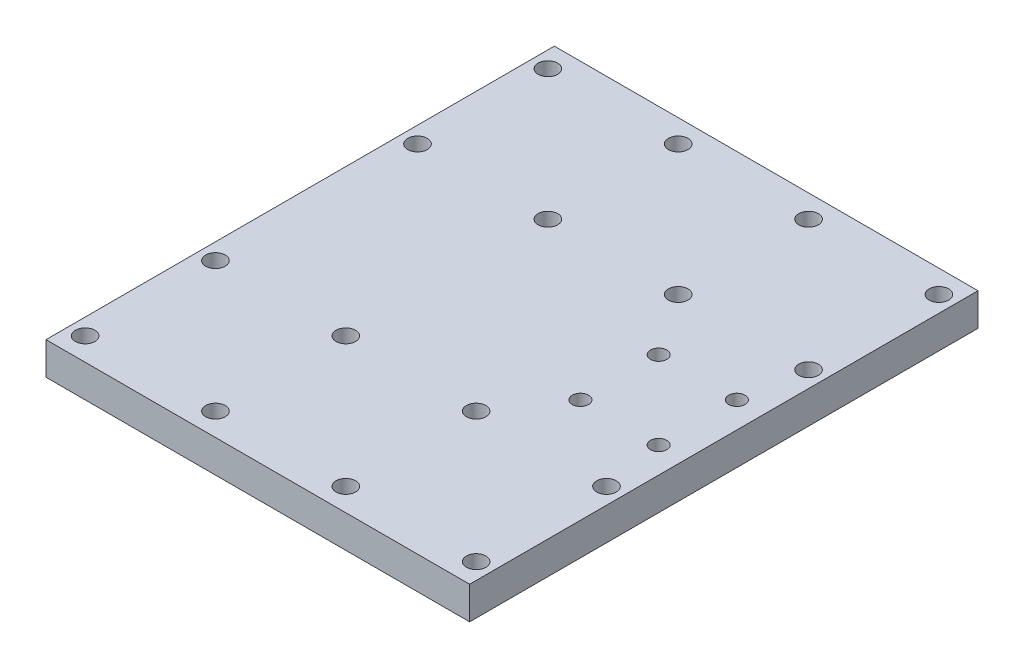
ISO-10303-21;
HEADER;
FILE_DESCRIPTION(('STEP AP214'),'2;1');
FILE_NAME('part.step','',(''),(''),'','','');
FILE_SCHEMA(('AUTOMOTIVE_DESIGN { 1 0 10303 214 1 1 1 1 }'));
ENDSEC;
DATA;
#1=APPLICATION_CONTEXT('core data for automotive mechanical design processes');
#2=APPLICATION_PROTOCOL_DEFINITION('international standard','automotive_design',2000,#1);
#3=PRODUCT_CONTEXT('',#1,'mechanical');
#4=PRODUCT('Part','Part','',(#3));
#5=PRODUCT_RELATED_PRODUCT_CATEGORY('part','',(#4));
#6=PRODUCT_DEFINITION_FORMATION('','',#4);
#7=PRODUCT_DEFINITION_CONTEXT('part definition',#1,'design');
#8=PRODUCT_DEFINITION('design','',#6,#7);
#9=PRODUCT_DEFINITION_SHAPE('','',#8);
#10=(LENGTH_UNIT() NAMED_UNIT(*) SI_UNIT(.MILLI.,.METRE.));
#11=(NAMED_UNIT(*) PLANE_ANGLE_UNIT() SI_UNIT($,.RADIAN.));
#12=(NAMED_UNIT(*) SI_UNIT($,.STERADIAN.) SOLID_ANGLE_UNIT());
#13=UNCERTAINTY_MEASURE_WITH_UNIT(LENGTH_MEASURE(1.E-05),#10,'distance_accuracy_value','');
#14=(GEOMETRIC_REPRESENTATION_CONTEXT(3) GLOBAL_UNCERTAINTY_ASSIGNED_CONTEXT((#13)) GLOBAL_UNIT_ASSIGNED_CONTEXT((#10,
#11,#12)) REPRESENTATION_CONTEXT('',''));
#15=CARTESIAN_POINT('',(0.,0.,0.));
#16=DIRECTION('',(0.,0.,1.));
#17=DIRECTION('',(1.,0.,0.));
#18=AXIS2_PLACEMENT_3D('',#15,#16,#17);
#19=CARTESIAN_POINT('',(130.,10.,0.));
#20=DIRECTION('',(-1.,0.,0.));
#21=DIRECTION('',(0.,0.,1.));
#22=AXIS2_PLACEMENT_3D('',#19,#20,#21);
#23=PLANE('',#22);
#24=DIRECTION('',(0.,0.,-1.));
#25=VECTOR('',#24,1.);
#26=CARTESIAN_POINT('',(130.,10.,0.));
#27=LINE('',#26,#25);
#28=CARTESIAN_POINT('',(130.,10.,121.506875339482));
#29=VERTEX_POINT('',#28);
#30=CARTESIAN_POINT('',(130.,10.,-34.4931246605184));
#31=VERTEX_POINT('',#30);
#32=EDGE_CURVE('E47',#29,#31,#27,.T.);
#33=ORIENTED_EDGE('',*,*,#32,.F.);
#34=DIRECTION('',(0.,1.,0.));
#35=VECTOR('',#34,1.);
#36=CARTESIAN_POINT('',(130.,0.,121.506875339482));
#37=LINE('',#36,#35);
#38=CARTESIAN_POINT('',(130.,0.,121.506875339482));
#39=VERTEX_POINT('',#38);
#40=EDGE_CURVE('E82',#39,#29,#37,.T.);
#41=ORIENTED_EDGE('',*,*,#40,.F.);
#42=DIRECTION('',(0.,0.,-1.));
#43=VECTOR('',#42,1.);
#44=CARTESIAN_POINT('',(130.,0.,0.));
#45=LINE('',#44,#43);
#46=CARTESIAN_POINT('',(130.,0.,-34.4931246605184));
#47=VERTEX_POINT('',#46);
#48=EDGE_CURVE('E63',#39,#47,#45,.T.);
#49=ORIENTED_EDGE('',*,*,#48,.T.);
#50=DIRECTION('',(0.,-1.,0.));
#51=VECTOR('',#50,1.);
#52=CARTESIAN_POINT('',(130.,10.,-34.4931246605184));
#53=LINE('',#52,#51);
#54=EDGE_CURVE('E222',#31,#47,#53,.T.);
#55=ORIENTED_EDGE('',*,*,#54,.F.);
#56=EDGE_LOOP('',(#33,#41,#49,#55));
#57=FACE_BOUND('',#56,.T.);
#58=ADVANCED_FACE('F38',(#57),#23,.F.);
#59=CARTESIAN_POINT('',(0.,10.,0.));
#60=DIRECTION('',(1.,0.,0.));
#61=DIRECTION('',(0.,0.,-1.));
#62=AXIS2_PLACEMENT_3D('',#59,#60,#61);
#63=PLANE('',#62);
#64=DIRECTION('',(0.,0.,1.));
#65=VECTOR('',#64,1.);
#66=CARTESIAN_POINT('',(0.,0.,0.));
#67=LINE('',#66,#65);
#68=CARTESIAN_POINT('',(0.,0.,-34.4931246605184));
#69=VERTEX_POINT('',#68);
#70=CARTESIAN_POINT('',(0.,0.,121.506875339482));
#71=VERTEX_POINT('',#70);
#72=EDGE_CURVE('E42',#69,#71,#67,.T.);
#73=ORIENTED_EDGE('',*,*,#72,.T.);
#74=DIRECTION('',(0.,-1.,0.));
#75=VECTOR('',#74,1.);
#76=CARTESIAN_POINT('',(0.,0.,121.506875339482));
#77=LINE('',#76,#75);
#78=CARTESIAN_POINT('',(0.,10.,121.506875339482));
#79=VERTEX_POINT('',#78);
#80=EDGE_CURVE('E55',#79,#71,#77,.T.);
#81=ORIENTED_EDGE('',*,*,#80,.F.);
#82=DIRECTION('',(0.,0.,1.));
#83=VECTOR('',#82,1.);
#84=CARTESIAN_POINT('',(0.,10.,0.));
#85=LINE('',#84,#83);
#86=CARTESIAN_POINT('',(0.,10.,-34.4931246605184));
#87=VERTEX_POINT('',#86);
#88=EDGE_CURVE('E11',#87,#79,#85,.T.);
#89=ORIENTED_EDGE('',*,*,#88,.F.);
#90=DIRECTION('',(0.,1.,0.));
#91=VECTOR('',#90,1.);
#92=CARTESIAN_POINT('',(0.,10.,-34.4931246605184));
#93=LINE('',#92,#91);
#94=EDGE_CURVE('E219',#69,#87,#93,.T.);
#95=ORIENTED_EDGE('',*,*,#94,.F.);
#96=EDGE_LOOP('',(#73,#81,#89,#95));
#97=FACE_BOUND('',#96,.T.);
#98=ADVANCED_FACE('F228',(#97),#63,.F.);
#99=CARTESIAN_POINT('',(0.,10.,0.));
#100=DIRECTION('',(0.,1.,0.));
#101=DIRECTION('',(0.,0.,1.));
#102=AXIS2_PLACEMENT_3D('',#99,#100,#101);
#103=PLANE('',#102);
#104=DIRECTION('',(-1.,0.,0.));
#105=VECTOR('',#104,1.);
#106=CARTESIAN_POINT('',(0.,10.,121.506875339482));
#107=LINE('',#106,#105);
#108=EDGE_CURVE('E89',#29,#79,#107,.T.);
#109=ORIENTED_EDGE('',*,*,#108,.F.);
#110=ORIENTED_EDGE('',*,*,#32,.T.);
#111=DIRECTION('',(1.,0.,0.));
#112=VECTOR('',#111,1.);
#113=CARTESIAN_POINT('',(130.,10.,-34.4931246605184));
#114=LINE('',#113,#112);
#115=EDGE_CURVE('E214',#87,#31,#114,.T.);
#116=ORIENTED_EDGE('',*,*,#115,.F.);
#117=ORIENTED_EDGE('',*,*,#88,.T.);
#118=EDGE_LOOP('',(#109,#110,#116,#117));
#119=FACE_BOUND('',#118,.T.);
#120=CARTESIAN_POINT('',(45.,10.,-27.4931246605184));
#121=DIRECTION('',(0.,1.,0.));
#122=DIRECTION('',(0.,0.,1.));
#123=AXIS2_PLACEMENT_3D('',#120,#121,#122);
#124=CIRCLE('',#123,3.);
#125=CARTESIAN_POINT('',(45.,10.,-24.4931246605184));
#126=VERTEX_POINT('',#125);
#127=EDGE_CURVE('E146',#126,#126,#124,.T.);
#128=ORIENTED_EDGE('',*,*,#127,.F.);
#129=EDGE_LOOP('',(#128));
#130=FACE_BOUND('',#129,.T.);
#131=CARTESIAN_POINT('',(45.,10.,12.5068753394816));
#132=DIRECTION('',(0.,1.,0.));
#133=DIRECTION('',(0.,0.,1.));
#134=AXIS2_PLACEMENT_3D('',#131,#132,#133);
#135=CIRCLE('',#134,3.);
#136=CARTESIAN_POINT('',(45.,10.,15.5068753394816));
#137=VERTEX_POINT('',#136);
#138=EDGE_CURVE('E149',#137,#137,#135,.T.);
#139=ORIENTED_EDGE('',*,*,#138,.F.);
#140=EDGE_LOOP('',(#139));
#141=FACE_BOUND('',#140,.T.);
#142=CARTESIAN_POINT('',(5.,10.,12.5068753394816));
#143=DIRECTION('',(0.,1.,0.));
#144=DIRECTION('',(0.,0.,1.));
#145=AXIS2_PLACEMENT_3D('',#142,#143,#144);
#146=CIRCLE('',#145,3.);
#147=CARTESIAN_POINT('',(5.,10.,15.5068753394816));
#148=VERTEX_POINT('',#147);
#149=EDGE_CURVE('E152',#148,#148,#146,.T.);
#150=ORIENTED_EDGE('',*,*,#149,.F.);
#151=EDGE_LOOP('',(#150));
#152=FACE_BOUND('',#151,.T.);
#153=CARTESIAN_POINT('',(85.,10.,-27.4931246605184));
#154=DIRECTION('',(0.,1.,0.));
#155=DIRECTION('',(0.,0.,1.));
#156=AXIS2_PLACEMENT_3D('',#153,#154,#155);
#157=CIRCLE('',#156,3.00000000000001);
#158=CARTESIAN_POINT('',(85.,10.,-24.4931246605183));
#159=VERTEX_POINT('',#158);
#160=EDGE_CURVE('E155',#159,#159,#157,.T.);
#161=ORIENTED_EDGE('',*,*,#160,.F.);
#162=EDGE_LOOP('',(#161));
#163=FACE_BOUND('',#162,.T.);
#164=CARTESIAN_POINT('',(125.,10.,-27.4931246605184));
#165=DIRECTION('',(0.,1.,0.));
#166=DIRECTION('',(0.,0.,1.));
#167=AXIS2_PLACEMENT_3D('',#164,#165,#166);
#168=CIRCLE('',#167,2.99999999999999);
#169=CARTESIAN_POINT('',(125.,10.,-24.4931246605184));
#170=VERTEX_POINT('',#169);
#171=EDGE_CURVE('E158',#170,#170,#168,.T.);
#172=ORIENTED_EDGE('',*,*,#171,.F.);
#173=EDGE_LOOP('',(#172));
#174=FACE_BOUND('',#173,.T.);
#175=CARTESIAN_POINT('',(85.,10.,12.5068753394817));
#176=DIRECTION('',(0.,1.,0.));
#177=DIRECTION('',(0.,0.,1.));
#178=AXIS2_PLACEMENT_3D('',#175,#176,#177);
#179=CIRCLE('',#178,3.00000000000001);
#180=CARTESIAN_POINT('',(85.,10.,15.5068753394817));
#181=VERTEX_POINT('',#180);
#182=EDGE_CURVE('E161',#181,#181,#179,.T.);
#183=ORIENTED_EDGE('',*,*,#182,.F.);
#184=EDGE_LOOP('',(#183));
#185=FACE_BOUND('',#184,.T.);
#186=CARTESIAN_POINT('',(125.,10.,12.5068753394816));
#187=DIRECTION('',(0.,1.,0.));
#188=DIRECTION('',(0.,0.,1.));
#189=AXIS2_PLACEMENT_3D('',#186,#187,#188);
#190=CIRCLE('',#189,2.99999999999999);
#191=CARTESIAN_POINT('',(125.,10.,15.5068753394816));
#192=VERTEX_POINT('',#191);
#193=EDGE_CURVE('E164',#192,#192,#190,.T.);
#194=ORIENTED_EDGE('',*,*,#193,.F.);
#195=EDGE_LOOP('',(#194));
#196=FACE_BOUND('',#195,.T.);
#197=CARTESIAN_POINT('',(85.,10.,74.5068753394817));
#198=DIRECTION('',(0.,1.,0.));
#199=DIRECTION('',(0.,0.,1.));
#200=AXIS2_PLACEMENT_3D('',#197,#198,#199);
#201=CIRCLE('',#200,3.00000000000001);
#202=CARTESIAN_POINT('',(85.,10.,77.5068753394817));
#203=VERTEX_POINT('',#202);
#204=EDGE_CURVE('E167',#203,#203,#201,.T.);
#205=ORIENTED_EDGE('',*,*,#204,.F.);
#206=EDGE_LOOP('',(#205));
#207=FACE_BOUND('',#206,.T.);
#208=CARTESIAN_POINT('',(125.,10.,74.5068753394817));
#209=DIRECTION('',(0.,1.,0.));
#210=DIRECTION('',(0.,0.,1.));
#211=AXIS2_PLACEMENT_3D('',#208,#209,#210);
#212=CIRCLE('',#211,2.99999999999999);
#213=CARTESIAN_POINT('',(125.,10.,77.5068753394816));
#214=VERTEX_POINT('',#213);
#215=EDGE_CURVE('E170',#214,#214,#212,.T.);
#216=ORIENTED_EDGE('',*,*,#215,.F.);
#217=EDGE_LOOP('',(#216));
#218=FACE_BOUND('',#217,.T.);
#219=CARTESIAN_POINT('',(85.,10.,114.506875339482));
#220=DIRECTION('',(0.,1.,0.));
#221=DIRECTION('',(0.,0.,1.));
#222=AXIS2_PLACEMENT_3D('',#219,#220,#221);
#223=CIRCLE('',#222,3.00000000000001);
#224=CARTESIAN_POINT('',(85.,10.,117.506875339482));
#225=VERTEX_POINT('',#224);
#226=EDGE_CURVE('E173',#225,#225,#223,.T.);
#227=ORIENTED_EDGE('',*,*,#226,.F.);
#228=EDGE_LOOP('',(#227));
#229=FACE_BOUND('',#228,.T.);
#230=CARTESIAN_POINT('',(5.00000000000001,10.,74.5068753394817));
#231=DIRECTION('',(0.,1.,0.));
#232=DIRECTION('',(0.,0.,1.));
#233=AXIS2_PLACEMENT_3D('',#230,#231,#232);
#234=CIRCLE('',#233,3.);
#235=CARTESIAN_POINT('',(5.00000000000001,10.,77.5068753394817));
#236=VERTEX_POINT('',#235);
#237=EDGE_CURVE('E176',#236,#236,#234,.T.);
#238=ORIENTED_EDGE('',*,*,#237,.F.);
#239=EDGE_LOOP('',(#238));
#240=FACE_BOUND('',#239,.T.);
#241=CARTESIAN_POINT('',(5.00000000000001,10.,114.506875339482));
#242=DIRECTION('',(0.,1.,0.));
#243=DIRECTION('',(0.,0.,1.));
#244=AXIS2_PLACEMENT_3D('',#241,#242,#243);
#245=CIRCLE('',#244,3.);
#246=CARTESIAN_POINT('',(5.00000000000001,10.,117.506875339482));
#247=VERTEX_POINT('',#246);
#248=EDGE_CURVE('E179',#247,#247,#245,.T.);
#249=ORIENTED_EDGE('',*,*,#248,.F.);
#250=EDGE_LOOP('',(#249));
#251=FACE_BOUND('',#250,.T.);
#252=CARTESIAN_POINT('',(45.,10.,74.5068753394817));
#253=DIRECTION('',(0.,1.,0.));
#254=DIRECTION('',(0.,0.,1.));
#255=AXIS2_PLACEMENT_3D('',#252,#253,#254);
#256=CIRCLE('',#255,3.);
#257=CARTESIAN_POINT('',(45.,10.,77.5068753394817));
#258=VERTEX_POINT('',#257);
#259=EDGE_CURVE('E182',#258,#258,#256,.T.);
#260=ORIENTED_EDGE('',*,*,#259,.F.);
#261=EDGE_LOOP('',(#260));
#262=FACE_BOUND('',#261,.T.);
#263=CARTESIAN_POINT('',(5.,10.,-27.4931246605184));
#264=DIRECTION('',(0.,1.,0.));
#265=DIRECTION('',(0.,0.,1.));
#266=AXIS2_PLACEMENT_3D('',#263,#264,#265);
#267=CIRCLE('',#266,3.);
#268=CARTESIAN_POINT('',(5.,10.,-24.4931246605184));
#269=VERTEX_POINT('',#268);
#270=EDGE_CURVE('E185',#269,#269,#267,.T.);
#271=ORIENTED_EDGE('',*,*,#270,.F.);
#272=EDGE_LOOP('',(#271));
#273=FACE_BOUND('',#272,.T.);
#274=CARTESIAN_POINT('',(125.,10.,114.506875339482));
#275=DIRECTION('',(0.,1.,0.));
#276=DIRECTION('',(0.,0.,1.));
#277=AXIS2_PLACEMENT_3D('',#274,#275,#276);
#278=CIRCLE('',#277,2.99999999999999);
#279=CARTESIAN_POINT('',(125.,10.,117.506875339482));
#280=VERTEX_POINT('',#279);
#281=EDGE_CURVE('E188',#280,#280,#278,.T.);
#282=ORIENTED_EDGE('',*,*,#281,.F.);
#283=EDGE_LOOP('',(#282));
#284=FACE_BOUND('',#283,.T.);
#285=CARTESIAN_POINT('',(45.,10.,114.506875339482));
#286=DIRECTION('',(0.,1.,0.));
#287=DIRECTION('',(0.,0.,1.));
#288=AXIS2_PLACEMENT_3D('',#285,#286,#287);
#289=CIRCLE('',#288,3.);
#290=CARTESIAN_POINT('',(45.,10.,117.506875339482));
#291=VERTEX_POINT('',#290);
#292=EDGE_CURVE('E95',#291,#291,#289,.T.);
#293=ORIENTED_EDGE('',*,*,#292,.F.);
#294=EDGE_LOOP('',(#293));
#295=FACE_BOUND('',#294,.T.);
#296=CARTESIAN_POINT('',(98.,10.,31.5068753394816));
#297=DIRECTION('',(0.,1.,0.));
#298=DIRECTION('',(0.,0.,1.));
#299=AXIS2_PLACEMENT_3D('',#296,#297,#298);
#300=CIRCLE('',#299,2.5);
#301=CARTESIAN_POINT('',(98.,10.,34.0068753394816));
#302=VERTEX_POINT('',#301);
#303=EDGE_CURVE('E193',#302,#302,#300,.T.);
#304=ORIENTED_EDGE('',*,*,#303,.F.);
#305=EDGE_LOOP('',(#304));
#306=FACE_BOUND('',#305,.T.);
#307=CARTESIAN_POINT('',(98.,10.,55.5068753394816));
#308=DIRECTION('',(0.,1.,0.));
#309=DIRECTION('',(0.,0.,1.));
#310=AXIS2_PLACEMENT_3D('',#307,#308,#309);
#311=CIRCLE('',#310,2.5);
#312=CARTESIAN_POINT('',(98.,10.,58.0068753394816));
#313=VERTEX_POINT('',#312);
#314=EDGE_CURVE('E199',#313,#313,#311,.T.);
#315=ORIENTED_EDGE('',*,*,#314,.F.);
#316=EDGE_LOOP('',(#315));
#317=FACE_BOUND('',#316,.T.);
#318=CARTESIAN_POINT('',(122.,10.,55.5068753394816));
#319=DIRECTION('',(0.,1.,0.));
#320=DIRECTION('',(0.,0.,1.));
#321=AXIS2_PLACEMENT_3D('',#318,#319,#320);
#322=CIRCLE('',#321,2.5);
#323=CARTESIAN_POINT('',(122.,10.,58.0068753394816));
#324=VERTEX_POINT('',#323);
#325=EDGE_CURVE('E205',#324,#324,#322,.T.);
#326=ORIENTED_EDGE('',*,*,#325,.F.);
#327=EDGE_LOOP('',(#326));
#328=FACE_BOUND('',#327,.T.);
#329=CARTESIAN_POINT('',(122.,10.,31.5068753394816));
#330=DIRECTION('',(0.,1.,0.));
#331=DIRECTION('',(0.,0.,1.));
#332=AXIS2_PLACEMENT_3D('',#329,#330,#331);
#333=CIRCLE('',#332,2.5);
#334=CARTESIAN_POINT('',(122.,10.,34.0068753394816));
#335=VERTEX_POINT('',#334);
#336=EDGE_CURVE('E211',#335,#335,#333,.T.);
#337=ORIENTED_EDGE('',*,*,#336,.F.);
#338=EDGE_LOOP('',(#337));
#339=FACE_BOUND('',#338,.T.);
#340=ADVANCED_FACE('F231',(#119,#130,#141,#152,#163,#174,#185,#196,#207,#218,#229,#240,#251,
#262,#273,#284,#295,#306,#317,#328,#339),#103,.T.);
#341=CARTESIAN_POINT('',(0.,0.,0.));
#342=DIRECTION('',(0.,1.,0.));
#343=DIRECTION('',(0.,0.,1.));
#344=AXIS2_PLACEMENT_3D('',#341,#342,#343);
#345=PLANE('',#344);
#346=CARTESIAN_POINT('',(45.,0.,-27.4931246605184));
#347=DIRECTION('',(0.,1.,0.));
#348=DIRECTION('',(0.,0.,1.));
#349=AXIS2_PLACEMENT_3D('',#346,#347,#348);
#350=CIRCLE('',#349,3.);
#351=CARTESIAN_POINT('',(45.,0.,-24.4931246605184));
#352=VERTEX_POINT('',#351);
#353=EDGE_CURVE('E94',#352,#352,#350,.T.);
#354=ORIENTED_EDGE('',*,*,#353,.T.);
#355=EDGE_LOOP('',(#354));
#356=FACE_BOUND('',#355,.T.);
#357=CARTESIAN_POINT('',(45.,0.,12.5068753394816));
#358=DIRECTION('',(0.,1.,0.));
#359=DIRECTION('',(0.,0.,1.));
#360=AXIS2_PLACEMENT_3D('',#357,#358,#359);
#361=CIRCLE('',#360,3.);
#362=CARTESIAN_POINT('',(45.,0.,15.5068753394816));
#363=VERTEX_POINT('',#362);
#364=EDGE_CURVE('E97',#363,#363,#361,.T.);
#365=ORIENTED_EDGE('',*,*,#364,.T.);
#366=EDGE_LOOP('',(#365));
#367=FACE_BOUND('',#366,.T.);
#368=CARTESIAN_POINT('',(5.,0.,12.5068753394816));
#369=DIRECTION('',(0.,1.,0.));
#370=DIRECTION('',(0.,0.,1.));
#371=AXIS2_PLACEMENT_3D('',#368,#369,#370);
#372=CIRCLE('',#371,3.);
#373=CARTESIAN_POINT('',(5.,0.,15.5068753394816));
#374=VERTEX_POINT('',#373);
#375=EDGE_CURVE('E102',#374,#374,#372,.T.);
#376=ORIENTED_EDGE('',*,*,#375,.T.);
#377=EDGE_LOOP('',(#376));
#378=FACE_BOUND('',#377,.T.);
#379=CARTESIAN_POINT('',(85.,0.,-27.4931246605184));
#380=DIRECTION('',(0.,1.,0.));
#381=DIRECTION('',(0.,0.,1.));
#382=AXIS2_PLACEMENT_3D('',#379,#380,#381);
#383=CIRCLE('',#382,3.00000000000001);
#384=CARTESIAN_POINT('',(85.,0.,-24.4931246605183));
#385=VERTEX_POINT('',#384);
#386=EDGE_CURVE('E105',#385,#385,#383,.T.);
#387=ORIENTED_EDGE('',*,*,#386,.T.);
#388=EDGE_LOOP('',(#387));
#389=FACE_BOUND('',#388,.T.);
#390=CARTESIAN_POINT('',(125.,0.,-27.4931246605184));
#391=DIRECTION('',(0.,1.,0.));
#392=DIRECTION('',(0.,0.,1.));
#393=AXIS2_PLACEMENT_3D('',#390,#391,#392);
#394=CIRCLE('',#393,2.99999999999999);
#395=CARTESIAN_POINT('',(125.,0.,-24.4931246605184));
#396=VERTEX_POINT('',#395);
#397=EDGE_CURVE('E108',#396,#396,#394,.T.);
#398=ORIENTED_EDGE('',*,*,#397,.T.);
#399=EDGE_LOOP('',(#398));
#400=FACE_BOUND('',#399,.T.);
#401=CARTESIAN_POINT('',(85.,0.,12.5068753394817));
#402=DIRECTION('',(0.,1.,0.));
#403=DIRECTION('',(0.,0.,1.));
#404=AXIS2_PLACEMENT_3D('',#401,#402,#403);
#405=CIRCLE('',#404,3.00000000000001);
#406=CARTESIAN_POINT('',(85.,0.,15.5068753394817));
#407=VERTEX_POINT('',#406);
#408=EDGE_CURVE('E111',#407,#407,#405,.T.);
#409=ORIENTED_EDGE('',*,*,#408,.T.);
#410=EDGE_LOOP('',(#409));
#411=FACE_BOUND('',#410,.T.);
#412=CARTESIAN_POINT('',(125.,0.,12.5068753394816));
#413=DIRECTION('',(0.,1.,0.));
#414=DIRECTION('',(0.,0.,1.));
#415=AXIS2_PLACEMENT_3D('',#412,#413,#414);
#416=CIRCLE('',#415,2.99999999999999);
#417=CARTESIAN_POINT('',(125.,0.,15.5068753394816));
#418=VERTEX_POINT('',#417);
#419=EDGE_CURVE('E114',#418,#418,#416,.T.);
#420=ORIENTED_EDGE('',*,*,#419,.T.);
#421=EDGE_LOOP('',(#420));
#422=FACE_BOUND('',#421,.T.);
#423=CARTESIAN_POINT('',(85.,0.,74.5068753394817));
#424=DIRECTION('',(0.,1.,0.));
#425=DIRECTION('',(0.,0.,1.));
#426=AXIS2_PLACEMENT_3D('',#423,#424,#425);
#427=CIRCLE('',#426,3.00000000000001);
#428=CARTESIAN_POINT('',(85.,0.,77.5068753394817));
#429=VERTEX_POINT('',#428);
#430=EDGE_CURVE('E117',#429,#429,#427,.T.);
#431=ORIENTED_EDGE('',*,*,#430,.T.);
#432=EDGE_LOOP('',(#431));
#433=FACE_BOUND('',#432,.T.);
#434=CARTESIAN_POINT('',(125.,0.,74.5068753394817));
#435=DIRECTION('',(0.,1.,0.));
#436=DIRECTION('',(0.,0.,1.));
#437=AXIS2_PLACEMENT_3D('',#434,#435,#436);
#438=CIRCLE('',#437,2.99999999999999);
#439=CARTESIAN_POINT('',(125.,0.,77.5068753394816));
#440=VERTEX_POINT('',#439);
#441=EDGE_CURVE('E120',#440,#440,#438,.T.);
#442=ORIENTED_EDGE('',*,*,#441,.T.);
#443=EDGE_LOOP('',(#442));
#444=FACE_BOUND('',#443,.T.);
#445=CARTESIAN_POINT('',(85.,0.,114.506875339482));
#446=DIRECTION('',(0.,1.,0.));
#447=DIRECTION('',(0.,0.,1.));
#448=AXIS2_PLACEMENT_3D('',#445,#446,#447);
#449=CIRCLE('',#448,3.00000000000001);
#450=CARTESIAN_POINT('',(85.,0.,117.506875339482));
#451=VERTEX_POINT('',#450);
#452=EDGE_CURVE('E123',#451,#451,#449,.T.);
#453=ORIENTED_EDGE('',*,*,#452,.T.);
#454=EDGE_LOOP('',(#453));
#455=FACE_BOUND('',#454,.T.);
#456=CARTESIAN_POINT('',(5.00000000000001,0.,74.5068753394817));
#457=DIRECTION('',(0.,1.,0.));
#458=DIRECTION('',(0.,0.,1.));
#459=AXIS2_PLACEMENT_3D('',#456,#457,#458);
#460=CIRCLE('',#459,3.);
#461=CARTESIAN_POINT('',(5.00000000000001,0.,77.5068753394817));
#462=VERTEX_POINT('',#461);
#463=EDGE_CURVE('E126',#462,#462,#460,.T.);
#464=ORIENTED_EDGE('',*,*,#463,.T.);
#465=EDGE_LOOP('',(#464));
#466=FACE_BOUND('',#465,.T.);
#467=CARTESIAN_POINT('',(5.00000000000001,0.,114.506875339482));
#468=DIRECTION('',(0.,1.,0.));
#469=DIRECTION('',(0.,0.,1.));
#470=AXIS2_PLACEMENT_3D('',#467,#468,#469);
#471=CIRCLE('',#470,3.);
#472=CARTESIAN_POINT('',(5.00000000000001,0.,117.506875339482));
#473=VERTEX_POINT('',#472);
#474=EDGE_CURVE('E129',#473,#473,#471,.T.);
#475=ORIENTED_EDGE('',*,*,#474,.T.);
#476=EDGE_LOOP('',(#475));
#477=FACE_BOUND('',#476,.T.);
#478=CARTESIAN_POINT('',(45.,0.,74.5068753394817));
#479=DIRECTION('',(0.,1.,0.));
#480=DIRECTION('',(0.,0.,1.));
#481=AXIS2_PLACEMENT_3D('',#478,#479,#480);
#482=CIRCLE('',#481,3.);
#483=CARTESIAN_POINT('',(45.,0.,77.5068753394817));
#484=VERTEX_POINT('',#483);
#485=EDGE_CURVE('E132',#484,#484,#482,.T.);
#486=ORIENTED_EDGE('',*,*,#485,.T.);
#487=EDGE_LOOP('',(#486));
#488=FACE_BOUND('',#487,.T.);
#489=CARTESIAN_POINT('',(5.,0.,-27.4931246605184));
#490=DIRECTION('',(0.,1.,0.));
#491=DIRECTION('',(0.,0.,1.));
#492=AXIS2_PLACEMENT_3D('',#489,#490,#491);
#493=CIRCLE('',#492,3.);
#494=CARTESIAN_POINT('',(5.,0.,-24.4931246605184));
#495=VERTEX_POINT('',#494);
#496=EDGE_CURVE('E135',#495,#495,#493,.T.);
#497=ORIENTED_EDGE('',*,*,#496,.T.);
#498=EDGE_LOOP('',(#497));
#499=FACE_BOUND('',#498,.T.);
#500=CARTESIAN_POINT('',(125.,0.,114.506875339482));
#501=DIRECTION('',(0.,1.,0.));
#502=DIRECTION('',(0.,0.,1.));
#503=AXIS2_PLACEMENT_3D('',#500,#501,#502);
#504=CIRCLE('',#503,2.99999999999999);
#505=CARTESIAN_POINT('',(125.,0.,117.506875339482));
#506=VERTEX_POINT('',#505);
#507=EDGE_CURVE('E138',#506,#506,#504,.T.);
#508=ORIENTED_EDGE('',*,*,#507,.T.);
#509=EDGE_LOOP('',(#508));
#510=FACE_BOUND('',#509,.T.);
#511=CARTESIAN_POINT('',(45.,0.,114.506875339482));
#512=DIRECTION('',(0.,1.,0.));
#513=DIRECTION('',(0.,0.,1.));
#514=AXIS2_PLACEMENT_3D('',#511,#512,#513);
#515=CIRCLE('',#514,3.);
#516=CARTESIAN_POINT('',(45.,0.,117.506875339482));
#517=VERTEX_POINT('',#516);
#518=EDGE_CURVE('E141',#517,#517,#515,.T.);
#519=ORIENTED_EDGE('',*,*,#518,.T.);
#520=EDGE_LOOP('',(#519));
#521=FACE_BOUND('',#520,.T.);
#522=CARTESIAN_POINT('',(98.,0.,31.5068753394816));
#523=DIRECTION('',(0.,1.,0.));
#524=DIRECTION('',(0.,0.,1.));
#525=AXIS2_PLACEMENT_3D('',#522,#523,#524);
#526=CIRCLE('',#525,2.5);
#527=CARTESIAN_POINT('',(98.,0.,34.0068753394816));
#528=VERTEX_POINT('',#527);
#529=EDGE_CURVE('E143',#528,#528,#526,.T.);
#530=ORIENTED_EDGE('',*,*,#529,.T.);
#531=EDGE_LOOP('',(#530));
#532=FACE_BOUND('',#531,.T.);
#533=CARTESIAN_POINT('',(98.,0.,55.5068753394816));
#534=DIRECTION('',(0.,1.,0.));
#535=DIRECTION('',(0.,0.,1.));
#536=AXIS2_PLACEMENT_3D('',#533,#534,#535);
#537=CIRCLE('',#536,2.5);
#538=CARTESIAN_POINT('',(98.,0.,58.0068753394816));
#539=VERTEX_POINT('',#538);
#540=EDGE_CURVE('E196',#539,#539,#537,.T.);
#541=ORIENTED_EDGE('',*,*,#540,.T.);
#542=EDGE_LOOP('',(#541));
#543=FACE_BOUND('',#542,.T.);
#544=CARTESIAN_POINT('',(122.,0.,55.5068753394816));
#545=DIRECTION('',(0.,1.,0.));
#546=DIRECTION('',(0.,0.,1.));
#547=AXIS2_PLACEMENT_3D('',#544,#545,#546);
#548=CIRCLE('',#547,2.5);
#549=CARTESIAN_POINT('',(122.,0.,58.0068753394816));
#550=VERTEX_POINT('',#549);
#551=EDGE_CURVE('E202',#550,#550,#548,.T.);
#552=ORIENTED_EDGE('',*,*,#551,.T.);
#553=EDGE_LOOP('',(#552));
#554=FACE_BOUND('',#553,.T.);
#555=CARTESIAN_POINT('',(122.,0.,31.5068753394816));
#556=DIRECTION('',(0.,1.,0.));
#557=DIRECTION('',(0.,0.,1.));
#558=AXIS2_PLACEMENT_3D('',#555,#556,#557);
#559=CIRCLE('',#558,2.5);
#560=CARTESIAN_POINT('',(122.,0.,34.0068753394816));
#561=VERTEX_POINT('',#560);
#562=EDGE_CURVE('E208',#561,#561,#559,.T.);
#563=ORIENTED_EDGE('',*,*,#562,.T.);
#564=EDGE_LOOP('',(#563));
#565=FACE_BOUND('',#564,.T.);
#566=ORIENTED_EDGE('',*,*,#48,.F.);
#567=DIRECTION('',(1.,0.,0.));
#568=VECTOR('',#567,1.);
#569=CARTESIAN_POINT('',(0.,0.,121.506875339482));
#570=LINE('',#569,#568);
#571=EDGE_CURVE('E80',#71,#39,#570,.T.);
#572=ORIENTED_EDGE('',*,*,#571,.F.);
#573=ORIENTED_EDGE('',*,*,#72,.F.);
#574=DIRECTION('',(-1.,0.,0.));
#575=VECTOR('',#574,1.);
#576=CARTESIAN_POINT('',(130.,0.,-34.4931246605184));
#577=LINE('',#576,#575);
#578=EDGE_CURVE('E93',#47,#69,#577,.T.);
#579=ORIENTED_EDGE('',*,*,#578,.F.);
#580=EDGE_LOOP('',(#566,#572,#573,#579));
#581=FACE_BOUND('',#580,.T.);
#582=ADVANCED_FACE('F92',(#356,#367,#378,#389,#400,#411,#422,#433,#444,#455,#466,#477,#488,#499,
#510,#521,#532,#543,#554,#565,#581),#345,.F.);
#583=CARTESIAN_POINT('',(45.,10.,-27.4931246605184));
#584=DIRECTION('',(0.,-1.,0.));
#585=DIRECTION('',(0.,0.,-1.));
#586=AXIS2_PLACEMENT_3D('',#583,#584,#585);
#587=CYLINDRICAL_SURFACE('',#586,3.);
#588=ORIENTED_EDGE('',*,*,#127,.T.);
#589=EDGE_LOOP('',(#588));
#590=FACE_BOUND('',#589,.T.);
#591=ORIENTED_EDGE('',*,*,#353,.F.);
#592=EDGE_LOOP('',(#591));
#593=FACE_BOUND('',#592,.T.);
#594=ADVANCED_FACE('F254',(#590,#593),#587,.F.);
#595=CARTESIAN_POINT('',(45.,10.,12.5068753394816));
#596=DIRECTION('',(0.,-1.,0.));
#597=DIRECTION('',(0.,0.,-1.));
#598=AXIS2_PLACEMENT_3D('',#595,#596,#597);
#599=CYLINDRICAL_SURFACE('',#598,3.);
#600=ORIENTED_EDGE('',*,*,#138,.T.);
#601=EDGE_LOOP('',(#600));
#602=FACE_BOUND('',#601,.T.);
#603=ORIENTED_EDGE('',*,*,#364,.F.);
#604=EDGE_LOOP('',(#603));
#605=FACE_BOUND('',#604,.T.);
#606=ADVANCED_FACE('F257',(#602,#605),#599,.F.);
#607=CARTESIAN_POINT('',(5.,10.,12.5068753394816));
#608=DIRECTION('',(0.,-1.,0.));
#609=DIRECTION('',(0.,0.,-1.));
#610=AXIS2_PLACEMENT_3D('',#607,#608,#609);
#611=CYLINDRICAL_SURFACE('',#610,3.);
#612=ORIENTED_EDGE('',*,*,#149,.T.);
#613=EDGE_LOOP('',(#612));
#614=FACE_BOUND('',#613,.T.);
#615=ORIENTED_EDGE('',*,*,#375,.F.);
#616=EDGE_LOOP('',(#615));
#617=FACE_BOUND('',#616,.T.);
#618=ADVANCED_FACE('F261',(#614,#617),#611,.F.);
#619=CARTESIAN_POINT('',(85.,10.,-27.4931246605184));
#620=DIRECTION('',(0.,-1.,0.));
#621=DIRECTION('',(0.,0.,-1.));
#622=AXIS2_PLACEMENT_3D('',#619,#620,#621);
#623=CYLINDRICAL_SURFACE('',#622,3.00000000000001);
#624=ORIENTED_EDGE('',*,*,#160,.T.);
#625=EDGE_LOOP('',(#624));
#626=FACE_BOUND('',#625,.T.);
#627=ORIENTED_EDGE('',*,*,#386,.F.);
#628=EDGE_LOOP('',(#627));
#629=FACE_BOUND('',#628,.T.);
#630=ADVANCED_FACE('F265',(#626,#629),#623,.F.);
#631=CARTESIAN_POINT('',(125.,10.,-27.4931246605184));
#632=DIRECTION('',(0.,-1.,0.));
#633=DIRECTION('',(0.,0.,-1.));
#634=AXIS2_PLACEMENT_3D('',#631,#632,#633);
#635=CYLINDRICAL_SURFACE('',#634,2.99999999999999);
#636=ORIENTED_EDGE('',*,*,#171,.T.);
#637=EDGE_LOOP('',(#636));
#638=FACE_BOUND('',#637,.T.);
#639=ORIENTED_EDGE('',*,*,#397,.F.);
#640=EDGE_LOOP('',(#639));
#641=FACE_BOUND('',#640,.T.);
#642=ADVANCED_FACE('F269',(#638,#641),#635,.F.);
#643=CARTESIAN_POINT('',(85.,10.,12.5068753394817));
#644=DIRECTION('',(0.,-1.,0.));
#645=DIRECTION('',(0.,0.,-1.));
#646=AXIS2_PLACEMENT_3D('',#643,#644,#645);
#647=CYLINDRICAL_SURFACE('',#646,3.00000000000001);
#648=ORIENTED_EDGE('',*,*,#182,.T.);
#649=EDGE_LOOP('',(#648));
#650=FACE_BOUND('',#649,.T.);
#651=ORIENTED_EDGE('',*,*,#408,.F.);
#652=EDGE_LOOP('',(#651));
#653=FACE_BOUND('',#652,.T.);
#654=ADVANCED_FACE('F273',(#650,#653),#647,.F.);
#655=CARTESIAN_POINT('',(125.,10.,12.5068753394816));
#656=DIRECTION('',(0.,-1.,0.));
#657=DIRECTION('',(0.,0.,-1.));
#658=AXIS2_PLACEMENT_3D('',#655,#656,#657);
#659=CYLINDRICAL_SURFACE('',#658,2.99999999999999);
#660=ORIENTED_EDGE('',*,*,#193,.T.);
#661=EDGE_LOOP('',(#660));
#662=FACE_BOUND('',#661,.T.);
#663=ORIENTED_EDGE('',*,*,#419,.F.);
#664=EDGE_LOOP('',(#663));
#665=FACE_BOUND('',#664,.T.);
#666=ADVANCED_FACE('F277',(#662,#665),#659,.F.);
#667=CARTESIAN_POINT('',(85.,10.,74.5068753394817));
#668=DIRECTION('',(0.,-1.,0.));
#669=DIRECTION('',(0.,0.,-1.));
#670=AXIS2_PLACEMENT_3D('',#667,#668,#669);
#671=CYLINDRICAL_SURFACE('',#670,3.00000000000001);
#672=ORIENTED_EDGE('',*,*,#204,.T.);
#673=EDGE_LOOP('',(#672));
#674=FACE_BOUND('',#673,.T.);
#675=ORIENTED_EDGE('',*,*,#430,.F.);
#676=EDGE_LOOP('',(#675));
#677=FACE_BOUND('',#676,.T.);
#678=ADVANCED_FACE('F281',(#674,#677),#671,.F.);
#679=CARTESIAN_POINT('',(125.,10.,74.5068753394817));
#680=DIRECTION('',(0.,-1.,0.));
#681=DIRECTION('',(0.,0.,-1.));
#682=AXIS2_PLACEMENT_3D('',#679,#680,#681);
#683=CYLINDRICAL_SURFACE('',#682,2.99999999999999);
#684=ORIENTED_EDGE('',*,*,#215,.T.);
#685=EDGE_LOOP('',(#684));
#686=FACE_BOUND('',#685,.T.);
#687=ORIENTED_EDGE('',*,*,#441,.F.);
#688=EDGE_LOOP('',(#687));
#689=FACE_BOUND('',#688,.T.);
#690=ADVANCED_FACE('F285',(#686,#689),#683,.F.);
#691=CARTESIAN_POINT('',(85.,10.,114.506875339482));
#692=DIRECTION('',(0.,-1.,0.));
#693=DIRECTION('',(0.,0.,-1.));
#694=AXIS2_PLACEMENT_3D('',#691,#692,#693);
#695=CYLINDRICAL_SURFACE('',#694,3.00000000000001);
#696=ORIENTED_EDGE('',*,*,#226,.T.);
#697=EDGE_LOOP('',(#696));
#698=FACE_BOUND('',#697,.T.);
#699=ORIENTED_EDGE('',*,*,#452,.F.);
#700=EDGE_LOOP('',(#699));
#701=FACE_BOUND('',#700,.T.);
#702=ADVANCED_FACE('F289',(#698,#701),#695,.F.);
#703=CARTESIAN_POINT('',(5.00000000000001,10.,74.5068753394817));
#704=DIRECTION('',(0.,-1.,0.));
#705=DIRECTION('',(0.,0.,-1.));
#706=AXIS2_PLACEMENT_3D('',#703,#704,#705);
#707=CYLINDRICAL_SURFACE('',#706,3.);
#708=ORIENTED_EDGE('',*,*,#237,.T.);
#709=EDGE_LOOP('',(#708));
#710=FACE_BOUND('',#709,.T.);
#711=ORIENTED_EDGE('',*,*,#463,.F.);
#712=EDGE_LOOP('',(#711));
#713=FACE_BOUND('',#712,.T.);
#714=ADVANCED_FACE('F293',(#710,#713),#707,.F.);
#715=CARTESIAN_POINT('',(5.00000000000001,10.,114.506875339482));
#716=DIRECTION('',(0.,-1.,0.));
#717=DIRECTION('',(0.,0.,-1.));
#718=AXIS2_PLACEMENT_3D('',#715,#716,#717);
#719=CYLINDRICAL_SURFACE('',#718,3.);
#720=ORIENTED_EDGE('',*,*,#248,.T.);
#721=EDGE_LOOP('',(#720));
#722=FACE_BOUND('',#721,.T.);
#723=ORIENTED_EDGE('',*,*,#474,.F.);
#724=EDGE_LOOP('',(#723));
#725=FACE_BOUND('',#724,.T.);
#726=ADVANCED_FACE('F297',(#722,#725),#719,.F.);
#727=CARTESIAN_POINT('',(45.,10.,74.5068753394817));
#728=DIRECTION('',(0.,-1.,0.));
#729=DIRECTION('',(0.,0.,-1.));
#730=AXIS2_PLACEMENT_3D('',#727,#728,#729);
#731=CYLINDRICAL_SURFACE('',#730,3.);
#732=ORIENTED_EDGE('',*,*,#259,.T.);
#733=EDGE_LOOP('',(#732));
#734=FACE_BOUND('',#733,.T.);
#735=ORIENTED_EDGE('',*,*,#485,.F.);
#736=EDGE_LOOP('',(#735));
#737=FACE_BOUND('',#736,.T.);
#738=ADVANCED_FACE('F301',(#734,#737),#731,.F.);
#739=CARTESIAN_POINT('',(5.,10.,-27.4931246605184));
#740=DIRECTION('',(0.,-1.,0.));
#741=DIRECTION('',(0.,0.,-1.));
#742=AXIS2_PLACEMENT_3D('',#739,#740,#741);
#743=CYLINDRICAL_SURFACE('',#742,3.);
#744=ORIENTED_EDGE('',*,*,#270,.T.);
#745=EDGE_LOOP('',(#744));
#746=FACE_BOUND('',#745,.T.);
#747=ORIENTED_EDGE('',*,*,#496,.F.);
#748=EDGE_LOOP('',(#747));
#749=FACE_BOUND('',#748,.T.);
#750=ADVANCED_FACE('F305',(#746,#749),#743,.F.);
#751=CARTESIAN_POINT('',(125.,10.,114.506875339482));
#752=DIRECTION('',(0.,-1.,0.));
#753=DIRECTION('',(0.,0.,-1.));
#754=AXIS2_PLACEMENT_3D('',#751,#752,#753);
#755=CYLINDRICAL_SURFACE('',#754,2.99999999999999);
#756=ORIENTED_EDGE('',*,*,#281,.T.);
#757=EDGE_LOOP('',(#756));
#758=FACE_BOUND('',#757,.T.);
#759=ORIENTED_EDGE('',*,*,#507,.F.);
#760=EDGE_LOOP('',(#759));
#761=FACE_BOUND('',#760,.T.);
#762=ADVANCED_FACE('F308',(#758,#761),#755,.F.);
#763=CARTESIAN_POINT('',(45.,10.,114.506875339482));
#764=DIRECTION('',(0.,-1.,0.));
#765=DIRECTION('',(0.,0.,-1.));
#766=AXIS2_PLACEMENT_3D('',#763,#764,#765);
#767=CYLINDRICAL_SURFACE('',#766,3.);
#768=ORIENTED_EDGE('',*,*,#292,.T.);
#769=EDGE_LOOP('',(#768));
#770=FACE_BOUND('',#769,.T.);
#771=ORIENTED_EDGE('',*,*,#518,.F.);
#772=EDGE_LOOP('',(#771));
#773=FACE_BOUND('',#772,.T.);
#774=ADVANCED_FACE('F40',(#770,#773),#767,.F.);
#775=CARTESIAN_POINT('',(98.,0.,31.5068753394816));
#776=DIRECTION('',(0.,1.,0.));
#777=DIRECTION('',(0.,0.,1.));
#778=AXIS2_PLACEMENT_3D('',#775,#776,#777);
#779=CYLINDRICAL_SURFACE('',#778,2.5);
#780=ORIENTED_EDGE('',*,*,#529,.F.);
#781=EDGE_LOOP('',(#780));
#782=FACE_BOUND('',#781,.T.);
#783=ORIENTED_EDGE('',*,*,#303,.T.);
#784=EDGE_LOOP('',(#783));
#785=FACE_BOUND('',#784,.T.);
#786=ADVANCED_FACE('F315',(#782,#785),#779,.F.);
#787=CARTESIAN_POINT('',(98.,0.,55.5068753394816));
#788=DIRECTION('',(0.,1.,0.));
#789=DIRECTION('',(0.,0.,1.));
#790=AXIS2_PLACEMENT_3D('',#787,#788,#789);
#791=CYLINDRICAL_SURFACE('',#790,2.5);
#792=ORIENTED_EDGE('',*,*,#540,.F.);
#793=EDGE_LOOP('',(#792));
#794=FACE_BOUND('',#793,.T.);
#795=ORIENTED_EDGE('',*,*,#314,.T.);
#796=EDGE_LOOP('',(#795));
#797=FACE_BOUND('',#796,.T.);
#798=ADVANCED_FACE('F343',(#794,#797),#791,.F.);
#799=CARTESIAN_POINT('',(122.,0.,55.5068753394816));
#800=DIRECTION('',(0.,1.,0.));
#801=DIRECTION('',(0.,0.,1.));
#802=AXIS2_PLACEMENT_3D('',#799,#800,#801);
#803=CYLINDRICAL_SURFACE('',#802,2.5);
#804=ORIENTED_EDGE('',*,*,#551,.F.);
#805=EDGE_LOOP('',(#804));
#806=FACE_BOUND('',#805,.T.);
#807=ORIENTED_EDGE('',*,*,#325,.T.);
#808=EDGE_LOOP('',(#807));
#809=FACE_BOUND('',#808,.T.);
#810=ADVANCED_FACE('F243',(#806,#809),#803,.F.);
#811=CARTESIAN_POINT('',(122.,0.,31.5068753394816));
#812=DIRECTION('',(0.,1.,0.));
#813=DIRECTION('',(0.,0.,1.));
#814=AXIS2_PLACEMENT_3D('',#811,#812,#813);
#815=CYLINDRICAL_SURFACE('',#814,2.5);
#816=ORIENTED_EDGE('',*,*,#562,.F.);
#817=EDGE_LOOP('',(#816));
#818=FACE_BOUND('',#817,.T.);
#819=ORIENTED_EDGE('',*,*,#336,.T.);
#820=EDGE_LOOP('',(#819));
#821=FACE_BOUND('',#820,.T.);
#822=ADVANCED_FACE('F236',(#818,#821),#815,.F.);
#823=CARTESIAN_POINT('',(0.,0.,-34.4931246605184));
#824=DIRECTION('',(0.,0.,-1.));
#825=DIRECTION('',(-1.,0.,0.));
#826=AXIS2_PLACEMENT_3D('',#823,#824,#825);
#827=PLANE('',#826);
#828=ORIENTED_EDGE('',*,*,#54,.T.);
#829=ORIENTED_EDGE('',*,*,#578,.T.);
#830=ORIENTED_EDGE('',*,*,#94,.T.);
#831=ORIENTED_EDGE('',*,*,#115,.T.);
#832=EDGE_LOOP('',(#828,#829,#830,#831));
#833=FACE_BOUND('',#832,.T.);
#834=ADVANCED_FACE('F234',(#833),#827,.T.);
#835=CARTESIAN_POINT('',(0.,0.,121.506875339482));
#836=DIRECTION('',(0.,0.,-1.));
#837=DIRECTION('',(-1.,0.,0.));
#838=AXIS2_PLACEMENT_3D('',#835,#836,#837);
#839=PLANE('',#838);
#840=ORIENTED_EDGE('',*,*,#80,.T.);
#841=ORIENTED_EDGE('',*,*,#571,.T.);
#842=ORIENTED_EDGE('',*,*,#40,.T.);
#843=ORIENTED_EDGE('',*,*,#108,.T.);
#844=EDGE_LOOP('',(#840,#841,#842,#843));
#845=FACE_BOUND('',#844,.T.);
#846=ADVANCED_FACE('F81',(#845),#839,.F.);
#847=CLOSED_SHELL('',(#58,#98,#340,#582,#594,#606,#618,#630,#642,#654,#666,#678,#690,#702,#714,
#726,#738,#750,#762,#774,#786,#798,#810,#822,#834,#846));
#848=MANIFOLD_SOLID_BREP('B2',#847);
#849=ADVANCED_BREP_SHAPE_REPRESENTATION('',(#18,#848),#14);
#850=SHAPE_DEFINITION_REPRESENTATION(#9,#849);
ENDSEC;
END-ISO-10303-21;
